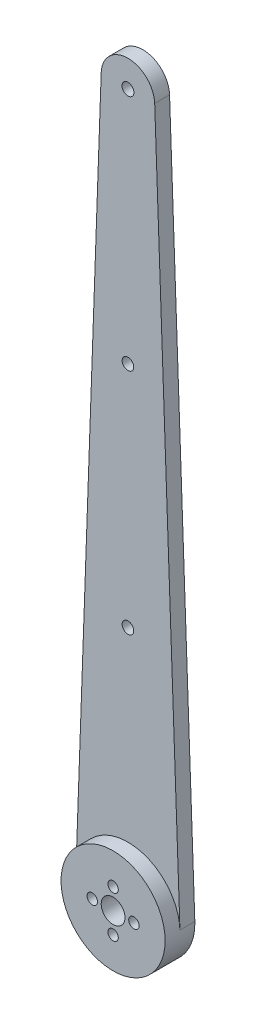
ISO-10303-21;
HEADER;
FILE_DESCRIPTION(('STEP AP214'),'2;1');
FILE_NAME('part.step','',(''),(''),'','','');
FILE_SCHEMA(('AUTOMOTIVE_DESIGN { 1 0 10303 214 1 1 1 1 }'));
ENDSEC;
DATA;
#1=APPLICATION_CONTEXT('core data for automotive mechanical design processes');
#2=APPLICATION_PROTOCOL_DEFINITION('international standard','automotive_design',2000,#1);
#3=PRODUCT_CONTEXT('',#1,'mechanical');
#4=PRODUCT('Part','Part','',(#3));
#5=PRODUCT_RELATED_PRODUCT_CATEGORY('part','',(#4));
#6=PRODUCT_DEFINITION_FORMATION('','',#4);
#7=PRODUCT_DEFINITION_CONTEXT('part definition',#1,'design');
#8=PRODUCT_DEFINITION('design','',#6,#7);
#9=PRODUCT_DEFINITION_SHAPE('','',#8);
#10=(LENGTH_UNIT() NAMED_UNIT(*) SI_UNIT(.MILLI.,.METRE.));
#11=(NAMED_UNIT(*) PLANE_ANGLE_UNIT() SI_UNIT($,.RADIAN.));
#12=(NAMED_UNIT(*) SI_UNIT($,.STERADIAN.) SOLID_ANGLE_UNIT());
#13=UNCERTAINTY_MEASURE_WITH_UNIT(LENGTH_MEASURE(1.E-05),#10,'distance_accuracy_value','');
#14=(GEOMETRIC_REPRESENTATION_CONTEXT(3) GLOBAL_UNCERTAINTY_ASSIGNED_CONTEXT((#13)) GLOBAL_UNIT_ASSIGNED_CONTEXT((#10,
#11,#12)) REPRESENTATION_CONTEXT('',''));
#15=CARTESIAN_POINT('',(0.,0.,0.));
#16=DIRECTION('',(0.,0.,1.));
#17=DIRECTION('',(1.,0.,0.));
#18=AXIS2_PLACEMENT_3D('',#15,#16,#17);
#19=CARTESIAN_POINT('',(0.,236.8,-5.));
#20=DIRECTION('',(0.,0.,1.));
#21=DIRECTION('',(1.,0.,0.));
#22=AXIS2_PLACEMENT_3D('',#19,#20,#21);
#23=CYLINDRICAL_SURFACE('',#22,9.00000000000001);
#24=CARTESIAN_POINT('',(0.,236.8,0.));
#25=DIRECTION('',(0.,0.,1.));
#26=DIRECTION('',(1.,0.,0.));
#27=AXIS2_PLACEMENT_3D('',#24,#25,#26);
#28=CIRCLE('',#27,9.00000000000001);
#29=CARTESIAN_POINT('',(8.99420001419527,237.123057432432,0.));
#30=VERTEX_POINT('',#29);
#31=CARTESIAN_POINT('',(-8.99420001419527,237.123057432432,0.));
#32=VERTEX_POINT('',#31);
#33=EDGE_CURVE('E139',#30,#32,#28,.T.);
#34=ORIENTED_EDGE('',*,*,#33,.F.);
#35=DIRECTION('',(0.,0.,1.));
#36=VECTOR('',#35,1.);
#37=CARTESIAN_POINT('',(8.99420001419527,237.123057432432,-5.));
#38=LINE('',#37,#36);
#39=CARTESIAN_POINT('',(8.99420001419527,237.123057432432,-5.));
#40=VERTEX_POINT('',#39);
#41=EDGE_CURVE('E11',#40,#30,#38,.T.);
#42=ORIENTED_EDGE('',*,*,#41,.F.);
#43=CARTESIAN_POINT('',(0.,236.8,-5.));
#44=DIRECTION('',(0.,0.,1.));
#45=DIRECTION('',(1.,0.,0.));
#46=AXIS2_PLACEMENT_3D('',#43,#44,#45);
#47=CIRCLE('',#46,9.00000000000001);
#48=CARTESIAN_POINT('',(-8.99420001419527,237.123057432432,-5.));
#49=VERTEX_POINT('',#48);
#50=EDGE_CURVE('E83',#40,#49,#47,.T.);
#51=ORIENTED_EDGE('',*,*,#50,.T.);
#52=DIRECTION('',(0.,0.,1.));
#53=VECTOR('',#52,1.);
#54=CARTESIAN_POINT('',(-8.99420001419527,237.123057432432,-5.));
#55=LINE('',#54,#53);
#56=EDGE_CURVE('E36',#49,#32,#55,.T.);
#57=ORIENTED_EDGE('',*,*,#56,.T.);
#58=EDGE_LOOP('',(#34,#42,#51,#57));
#59=FACE_BOUND('',#58,.T.);
#60=ADVANCED_FACE('F33',(#59),#23,.T.);
#61=CARTESIAN_POINT('',(8.99420001419527,237.123057432432,-5.));
#62=DIRECTION('',(0.999355557132808,0.0358952702702703,0.));
#63=DIRECTION('',(-0.0358952702702703,0.999355557132808,0.));
#64=AXIS2_PLACEMENT_3D('',#61,#62,#63);
#65=PLANE('',#64);
#66=DIRECTION('',(-0.0358952702702703,0.999355557132807,0.));
#67=VECTOR('',#66,1.);
#68=CARTESIAN_POINT('',(8.99420001419527,237.123057432432,0.));
#69=LINE('',#68,#67);
#70=CARTESIAN_POINT('',(17.4887222498241,0.62816722972973,0.));
#71=VERTEX_POINT('',#70);
#72=EDGE_CURVE('E76',#71,#30,#69,.T.);
#73=ORIENTED_EDGE('',*,*,#72,.F.);
#74=DIRECTION('',(0.,0.,1.));
#75=VECTOR('',#74,1.);
#76=CARTESIAN_POINT('',(17.4887222498241,0.62816722972973,-5.));
#77=LINE('',#76,#75);
#78=CARTESIAN_POINT('',(17.4887222498241,0.62816722972973,-5.));
#79=VERTEX_POINT('',#78);
#80=EDGE_CURVE('E42',#79,#71,#77,.T.);
#81=ORIENTED_EDGE('',*,*,#80,.F.);
#82=DIRECTION('',(-0.0358952702702703,0.999355557132807,0.));
#83=VECTOR('',#82,1.);
#84=CARTESIAN_POINT('',(8.99420001419527,237.123057432432,-5.));
#85=LINE('',#84,#83);
#86=EDGE_CURVE('E144',#79,#40,#85,.T.);
#87=ORIENTED_EDGE('',*,*,#86,.T.);
#88=ORIENTED_EDGE('',*,*,#41,.T.);
#89=EDGE_LOOP('',(#73,#81,#87,#88));
#90=FACE_BOUND('',#89,.T.);
#91=ADVANCED_FACE('F78',(#90),#65,.T.);
#92=CARTESIAN_POINT('',(0.,0.,-5.));
#93=DIRECTION('',(0.,0.,1.));
#94=DIRECTION('',(1.,0.,0.));
#95=AXIS2_PLACEMENT_3D('',#92,#93,#94);
#96=CYLINDRICAL_SURFACE('',#95,17.5);
#97=ORIENTED_EDGE('',*,*,#80,.T.);
#98=CARTESIAN_POINT('',(0.,0.,0.));
#99=DIRECTION('',(0.,0.,1.));
#100=DIRECTION('',(1.,0.,0.));
#101=AXIS2_PLACEMENT_3D('',#98,#99,#100);
#102=CIRCLE('',#101,17.5);
#103=CARTESIAN_POINT('',(-17.4887222498241,0.628167229729727,0.));
#104=VERTEX_POINT('',#103);
#105=EDGE_CURVE('E90',#71,#104,#102,.T.);
#106=ORIENTED_EDGE('',*,*,#105,.T.);
#107=DIRECTION('',(0.,0.,1.));
#108=VECTOR('',#107,1.);
#109=CARTESIAN_POINT('',(-17.4887222498241,0.628167229729727,-5.));
#110=LINE('',#109,#108);
#111=CARTESIAN_POINT('',(-17.4887222498241,0.628167229729727,-5.));
#112=VERTEX_POINT('',#111);
#113=EDGE_CURVE('E65',#112,#104,#110,.T.);
#114=ORIENTED_EDGE('',*,*,#113,.F.);
#115=CARTESIAN_POINT('',(0.,0.,-5.));
#116=DIRECTION('',(0.,0.,1.));
#117=DIRECTION('',(1.,0.,0.));
#118=AXIS2_PLACEMENT_3D('',#115,#116,#117);
#119=CIRCLE('',#118,17.5);
#120=EDGE_CURVE('E92',#112,#79,#119,.T.);
#121=ORIENTED_EDGE('',*,*,#120,.T.);
#122=EDGE_LOOP('',(#97,#106,#114,#121));
#123=FACE_BOUND('',#122,.T.);
#124=CARTESIAN_POINT('',(0.,0.,5.));
#125=DIRECTION('',(0.,0.,1.));
#126=DIRECTION('',(1.,0.,0.));
#127=AXIS2_PLACEMENT_3D('',#124,#125,#126);
#128=CIRCLE('',#127,17.5);
#129=CARTESIAN_POINT('',(17.5,0.,5.));
#130=VERTEX_POINT('',#129);
#131=EDGE_CURVE('E97',#130,#130,#128,.T.);
#132=ORIENTED_EDGE('',*,*,#131,.F.);
#133=EDGE_LOOP('',(#132));
#134=FACE_BOUND('',#133,.T.);
#135=ADVANCED_FACE('F88',(#123,#134),#96,.T.);
#136=CARTESIAN_POINT('',(-8.99420001419527,237.123057432432,-5.));
#137=DIRECTION('',(-0.999355557132808,0.0358952702702703,0.));
#138=DIRECTION('',(-0.0358952702702703,-0.999355557132808,0.));
#139=AXIS2_PLACEMENT_3D('',#136,#137,#138);
#140=PLANE('',#139);
#141=DIRECTION('',(-0.0358952702702703,-0.999355557132807,0.));
#142=VECTOR('',#141,1.);
#143=CARTESIAN_POINT('',(-8.99420001419527,237.123057432432,0.));
#144=LINE('',#143,#142);
#145=EDGE_CURVE('E84',#32,#104,#144,.T.);
#146=ORIENTED_EDGE('',*,*,#145,.F.);
#147=ORIENTED_EDGE('',*,*,#56,.F.);
#148=DIRECTION('',(-0.0358952702702703,-0.999355557132807,0.));
#149=VECTOR('',#148,1.);
#150=CARTESIAN_POINT('',(-8.99420001419527,237.123057432432,-5.));
#151=LINE('',#150,#149);
#152=EDGE_CURVE('E141',#49,#112,#151,.T.);
#153=ORIENTED_EDGE('',*,*,#152,.T.);
#154=ORIENTED_EDGE('',*,*,#113,.T.);
#155=EDGE_LOOP('',(#146,#147,#153,#154));
#156=FACE_BOUND('',#155,.T.);
#157=ADVANCED_FACE('F147',(#156),#140,.T.);
#158=CARTESIAN_POINT('',(0.,236.8,-5.));
#159=DIRECTION('',(0.,0.,1.));
#160=DIRECTION('',(1.,0.,0.));
#161=AXIS2_PLACEMENT_3D('',#158,#159,#160);
#162=PLANE('',#161);
#163=CARTESIAN_POINT('',(7.,0.,-5.));
#164=DIRECTION('',(0.,0.,1.));
#165=DIRECTION('',(1.,0.,0.));
#166=AXIS2_PLACEMENT_3D('',#163,#164,#165);
#167=CIRCLE('',#166,1.75);
#168=CARTESIAN_POINT('',(8.75,0.,-5.));
#169=VERTEX_POINT('',#168);
#170=EDGE_CURVE('E115',#169,#169,#167,.T.);
#171=ORIENTED_EDGE('',*,*,#170,.T.);
#172=EDGE_LOOP('',(#171));
#173=FACE_BOUND('',#172,.T.);
#174=CARTESIAN_POINT('',(0.,7.,-5.));
#175=DIRECTION('',(0.,0.,1.));
#176=DIRECTION('',(1.,0.,0.));
#177=AXIS2_PLACEMENT_3D('',#174,#175,#176);
#178=CIRCLE('',#177,1.75);
#179=CARTESIAN_POINT('',(1.75,7.,-5.));
#180=VERTEX_POINT('',#179);
#181=EDGE_CURVE('E112',#180,#180,#178,.T.);
#182=ORIENTED_EDGE('',*,*,#181,.T.);
#183=EDGE_LOOP('',(#182));
#184=FACE_BOUND('',#183,.T.);
#185=CARTESIAN_POINT('',(0.,-7.,-5.));
#186=DIRECTION('',(0.,0.,1.));
#187=DIRECTION('',(1.,0.,0.));
#188=AXIS2_PLACEMENT_3D('',#185,#186,#187);
#189=CIRCLE('',#188,1.75);
#190=CARTESIAN_POINT('',(1.75,-7.,-5.));
#191=VERTEX_POINT('',#190);
#192=EDGE_CURVE('E109',#191,#191,#189,.T.);
#193=ORIENTED_EDGE('',*,*,#192,.T.);
#194=EDGE_LOOP('',(#193));
#195=FACE_BOUND('',#194,.T.);
#196=CARTESIAN_POINT('',(-7.,0.,-5.));
#197=DIRECTION('',(0.,0.,1.));
#198=DIRECTION('',(1.,0.,0.));
#199=AXIS2_PLACEMENT_3D('',#196,#197,#198);
#200=CIRCLE('',#199,1.75);
#201=CARTESIAN_POINT('',(-5.25,0.,-5.));
#202=VERTEX_POINT('',#201);
#203=EDGE_CURVE('E101',#202,#202,#200,.T.);
#204=ORIENTED_EDGE('',*,*,#203,.T.);
#205=EDGE_LOOP('',(#204));
#206=FACE_BOUND('',#205,.T.);
#207=CARTESIAN_POINT('',(0.,156.8,-5.));
#208=DIRECTION('',(0.,0.,1.));
#209=DIRECTION('',(1.,0.,0.));
#210=AXIS2_PLACEMENT_3D('',#207,#208,#209);
#211=CIRCLE('',#210,1.94999999999999);
#212=CARTESIAN_POINT('',(1.95,156.8,-5.));
#213=VERTEX_POINT('',#212);
#214=EDGE_CURVE('E121',#213,#213,#211,.T.);
#215=ORIENTED_EDGE('',*,*,#214,.T.);
#216=EDGE_LOOP('',(#215));
#217=FACE_BOUND('',#216,.T.);
#218=CARTESIAN_POINT('',(0.,80.,-5.));
#219=DIRECTION('',(0.,0.,1.));
#220=DIRECTION('',(1.,0.,0.));
#221=AXIS2_PLACEMENT_3D('',#218,#219,#220);
#222=CIRCLE('',#221,1.94999999999999);
#223=CARTESIAN_POINT('',(1.95000000000001,80.,-5.));
#224=VERTEX_POINT('',#223);
#225=EDGE_CURVE('E127',#224,#224,#222,.T.);
#226=ORIENTED_EDGE('',*,*,#225,.T.);
#227=EDGE_LOOP('',(#226));
#228=FACE_BOUND('',#227,.T.);
#229=CARTESIAN_POINT('',(0.,236.8,-5.));
#230=DIRECTION('',(0.,0.,1.));
#231=DIRECTION('',(1.,0.,0.));
#232=AXIS2_PLACEMENT_3D('',#229,#230,#231);
#233=CIRCLE('',#232,2.);
#234=CARTESIAN_POINT('',(2.,236.8,-5.));
#235=VERTEX_POINT('',#234);
#236=EDGE_CURVE('E131',#235,#235,#233,.T.);
#237=ORIENTED_EDGE('',*,*,#236,.T.);
#238=EDGE_LOOP('',(#237));
#239=FACE_BOUND('',#238,.T.);
#240=CARTESIAN_POINT('',(0.,0.,-5.));
#241=DIRECTION('',(0.,0.,1.));
#242=DIRECTION('',(1.,0.,0.));
#243=AXIS2_PLACEMENT_3D('',#240,#241,#242);
#244=CIRCLE('',#243,4.);
#245=CARTESIAN_POINT('',(4.,0.,-5.));
#246=VERTEX_POINT('',#245);
#247=EDGE_CURVE('E134',#246,#246,#244,.T.);
#248=ORIENTED_EDGE('',*,*,#247,.T.);
#249=EDGE_LOOP('',(#248));
#250=FACE_BOUND('',#249,.T.);
#251=ORIENTED_EDGE('',*,*,#50,.F.);
#252=ORIENTED_EDGE('',*,*,#86,.F.);
#253=ORIENTED_EDGE('',*,*,#120,.F.);
#254=ORIENTED_EDGE('',*,*,#152,.F.);
#255=EDGE_LOOP('',(#251,#252,#253,#254));
#256=FACE_BOUND('',#255,.T.);
#257=ADVANCED_FACE('F149',(#173,#184,#195,#206,#217,#228,#239,#250,#256),#162,.F.);
#258=CARTESIAN_POINT('',(0.,236.8,0.));
#259=DIRECTION('',(0.,0.,1.));
#260=DIRECTION('',(1.,0.,0.));
#261=AXIS2_PLACEMENT_3D('',#258,#259,#260);
#262=PLANE('',#261);
#263=ORIENTED_EDGE('',*,*,#105,.F.);
#264=ORIENTED_EDGE('',*,*,#72,.T.);
#265=ORIENTED_EDGE('',*,*,#33,.T.);
#266=ORIENTED_EDGE('',*,*,#145,.T.);
#267=EDGE_LOOP('',(#263,#264,#265,#266));
#268=FACE_BOUND('',#267,.T.);
#269=CARTESIAN_POINT('',(0.,156.8,0.));
#270=DIRECTION('',(0.,0.,1.));
#271=DIRECTION('',(1.,0.,0.));
#272=AXIS2_PLACEMENT_3D('',#269,#270,#271);
#273=CIRCLE('',#272,1.94999999999999);
#274=CARTESIAN_POINT('',(1.95,156.8,0.));
#275=VERTEX_POINT('',#274);
#276=EDGE_CURVE('E118',#275,#275,#273,.T.);
#277=ORIENTED_EDGE('',*,*,#276,.F.);
#278=EDGE_LOOP('',(#277));
#279=FACE_BOUND('',#278,.T.);
#280=CARTESIAN_POINT('',(0.,80.,0.));
#281=DIRECTION('',(0.,0.,1.));
#282=DIRECTION('',(1.,0.,0.));
#283=AXIS2_PLACEMENT_3D('',#280,#281,#282);
#284=CIRCLE('',#283,1.94999999999999);
#285=CARTESIAN_POINT('',(1.95000000000001,80.,0.));
#286=VERTEX_POINT('',#285);
#287=EDGE_CURVE('E124',#286,#286,#284,.T.);
#288=ORIENTED_EDGE('',*,*,#287,.F.);
#289=EDGE_LOOP('',(#288));
#290=FACE_BOUND('',#289,.T.);
#291=CARTESIAN_POINT('',(0.,236.8,0.));
#292=DIRECTION('',(0.,0.,1.));
#293=DIRECTION('',(1.,0.,0.));
#294=AXIS2_PLACEMENT_3D('',#291,#292,#293);
#295=CIRCLE('',#294,2.);
#296=CARTESIAN_POINT('',(2.,236.8,0.));
#297=VERTEX_POINT('',#296);
#298=EDGE_CURVE('E130',#297,#297,#295,.T.);
#299=ORIENTED_EDGE('',*,*,#298,.F.);
#300=EDGE_LOOP('',(#299));
#301=FACE_BOUND('',#300,.T.);
#302=ADVANCED_FACE('F95',(#268,#279,#290,#301),#262,.T.);
#303=CARTESIAN_POINT('',(0.,0.,-5.));
#304=DIRECTION('',(0.,0.,1.));
#305=DIRECTION('',(1.,0.,0.));
#306=AXIS2_PLACEMENT_3D('',#303,#304,#305);
#307=CYLINDRICAL_SURFACE('',#306,4.);
#308=ORIENTED_EDGE('',*,*,#247,.F.);
#309=EDGE_LOOP('',(#308));
#310=FACE_BOUND('',#309,.T.);
#311=CARTESIAN_POINT('',(0.,0.,5.));
#312=DIRECTION('',(0.,0.,1.));
#313=DIRECTION('',(1.,0.,0.));
#314=AXIS2_PLACEMENT_3D('',#311,#312,#313);
#315=CIRCLE('',#314,4.);
#316=CARTESIAN_POINT('',(4.,0.,5.));
#317=VERTEX_POINT('',#316);
#318=EDGE_CURVE('E218',#317,#317,#315,.T.);
#319=ORIENTED_EDGE('',*,*,#318,.T.);
#320=EDGE_LOOP('',(#319));
#321=FACE_BOUND('',#320,.T.);
#322=ADVANCED_FACE('F166',(#310,#321),#307,.F.);
#323=CARTESIAN_POINT('',(0.,236.8,-5.));
#324=DIRECTION('',(0.,0.,1.));
#325=DIRECTION('',(1.,0.,0.));
#326=AXIS2_PLACEMENT_3D('',#323,#324,#325);
#327=CYLINDRICAL_SURFACE('',#326,2.);
#328=ORIENTED_EDGE('',*,*,#236,.F.);
#329=EDGE_LOOP('',(#328));
#330=FACE_BOUND('',#329,.T.);
#331=ORIENTED_EDGE('',*,*,#298,.T.);
#332=EDGE_LOOP('',(#331));
#333=FACE_BOUND('',#332,.T.);
#334=ADVANCED_FACE('F170',(#330,#333),#327,.F.);
#335=CARTESIAN_POINT('',(0.,80.,0.));
#336=DIRECTION('',(0.,0.,1.));
#337=DIRECTION('',(1.,0.,0.));
#338=AXIS2_PLACEMENT_3D('',#335,#336,#337);
#339=CYLINDRICAL_SURFACE('',#338,1.94999999999999);
#340=ORIENTED_EDGE('',*,*,#287,.T.);
#341=EDGE_LOOP('',(#340));
#342=FACE_BOUND('',#341,.T.);
#343=ORIENTED_EDGE('',*,*,#225,.F.);
#344=EDGE_LOOP('',(#343));
#345=FACE_BOUND('',#344,.T.);
#346=ADVANCED_FACE('F174',(#342,#345),#339,.F.);
#347=CARTESIAN_POINT('',(0.,156.8,0.));
#348=DIRECTION('',(0.,0.,1.));
#349=DIRECTION('',(1.,0.,0.));
#350=AXIS2_PLACEMENT_3D('',#347,#348,#349);
#351=CYLINDRICAL_SURFACE('',#350,1.94999999999999);
#352=ORIENTED_EDGE('',*,*,#276,.T.);
#353=EDGE_LOOP('',(#352));
#354=FACE_BOUND('',#353,.T.);
#355=ORIENTED_EDGE('',*,*,#214,.F.);
#356=EDGE_LOOP('',(#355));
#357=FACE_BOUND('',#356,.T.);
#358=ADVANCED_FACE('F178',(#354,#357),#351,.F.);
#359=CARTESIAN_POINT('',(-7.,0.,-10.));
#360=DIRECTION('',(0.,0.,1.));
#361=DIRECTION('',(1.,0.,0.));
#362=AXIS2_PLACEMENT_3D('',#359,#360,#361);
#363=CYLINDRICAL_SURFACE('',#362,1.75);
#364=ORIENTED_EDGE('',*,*,#203,.F.);
#365=EDGE_LOOP('',(#364));
#366=FACE_BOUND('',#365,.T.);
#367=CARTESIAN_POINT('',(-7.,0.,5.));
#368=DIRECTION('',(0.,0.,1.));
#369=DIRECTION('',(1.,0.,0.));
#370=AXIS2_PLACEMENT_3D('',#367,#368,#369);
#371=CIRCLE('',#370,1.75);
#372=CARTESIAN_POINT('',(-5.25,0.,5.));
#373=VERTEX_POINT('',#372);
#374=EDGE_CURVE('E207',#373,#373,#371,.T.);
#375=ORIENTED_EDGE('',*,*,#374,.T.);
#376=EDGE_LOOP('',(#375));
#377=FACE_BOUND('',#376,.T.);
#378=ADVANCED_FACE('F182',(#366,#377),#363,.F.);
#379=CARTESIAN_POINT('',(0.,-7.,-10.));
#380=DIRECTION('',(0.,0.,1.));
#381=DIRECTION('',(1.,0.,0.));
#382=AXIS2_PLACEMENT_3D('',#379,#380,#381);
#383=CYLINDRICAL_SURFACE('',#382,1.75);
#384=ORIENTED_EDGE('',*,*,#192,.F.);
#385=EDGE_LOOP('',(#384));
#386=FACE_BOUND('',#385,.T.);
#387=CARTESIAN_POINT('',(0.,-7.,5.));
#388=DIRECTION('',(0.,0.,1.));
#389=DIRECTION('',(1.,0.,0.));
#390=AXIS2_PLACEMENT_3D('',#387,#388,#389);
#391=CIRCLE('',#390,1.75);
#392=CARTESIAN_POINT('',(1.75,-7.,5.));
#393=VERTEX_POINT('',#392);
#394=EDGE_CURVE('E104',#393,#393,#391,.T.);
#395=ORIENTED_EDGE('',*,*,#394,.T.);
#396=EDGE_LOOP('',(#395));
#397=FACE_BOUND('',#396,.T.);
#398=ADVANCED_FACE('F186',(#386,#397),#383,.F.);
#399=CARTESIAN_POINT('',(0.,7.,-10.));
#400=DIRECTION('',(0.,0.,1.));
#401=DIRECTION('',(1.,0.,0.));
#402=AXIS2_PLACEMENT_3D('',#399,#400,#401);
#403=CYLINDRICAL_SURFACE('',#402,1.75);
#404=ORIENTED_EDGE('',*,*,#181,.F.);
#405=EDGE_LOOP('',(#404));
#406=FACE_BOUND('',#405,.T.);
#407=CARTESIAN_POINT('',(0.,7.,5.));
#408=DIRECTION('',(0.,0.,1.));
#409=DIRECTION('',(1.,0.,0.));
#410=AXIS2_PLACEMENT_3D('',#407,#408,#409);
#411=CIRCLE('',#410,1.75);
#412=CARTESIAN_POINT('',(1.75,7.,5.));
#413=VERTEX_POINT('',#412);
#414=EDGE_CURVE('E221',#413,#413,#411,.T.);
#415=ORIENTED_EDGE('',*,*,#414,.T.);
#416=EDGE_LOOP('',(#415));
#417=FACE_BOUND('',#416,.T.);
#418=ADVANCED_FACE('F190',(#406,#417),#403,.F.);
#419=CARTESIAN_POINT('',(7.,0.,-10.));
#420=DIRECTION('',(0.,0.,1.));
#421=DIRECTION('',(1.,0.,0.));
#422=AXIS2_PLACEMENT_3D('',#419,#420,#421);
#423=CYLINDRICAL_SURFACE('',#422,1.75);
#424=ORIENTED_EDGE('',*,*,#170,.F.);
#425=EDGE_LOOP('',(#424));
#426=FACE_BOUND('',#425,.T.);
#427=CARTESIAN_POINT('',(7.,0.,5.));
#428=DIRECTION('',(0.,0.,1.));
#429=DIRECTION('',(1.,0.,0.));
#430=AXIS2_PLACEMENT_3D('',#427,#428,#429);
#431=CIRCLE('',#430,1.75);
#432=CARTESIAN_POINT('',(8.75,0.,5.));
#433=VERTEX_POINT('',#432);
#434=EDGE_CURVE('E98',#433,#433,#431,.T.);
#435=ORIENTED_EDGE('',*,*,#434,.T.);
#436=EDGE_LOOP('',(#435));
#437=FACE_BOUND('',#436,.T.);
#438=ADVANCED_FACE('F194',(#426,#437),#423,.F.);
#439=CARTESIAN_POINT('',(0.,0.,5.));
#440=DIRECTION('',(0.,0.,1.));
#441=DIRECTION('',(1.,0.,0.));
#442=AXIS2_PLACEMENT_3D('',#439,#440,#441);
#443=PLANE('',#442);
#444=ORIENTED_EDGE('',*,*,#374,.F.);
#445=EDGE_LOOP('',(#444));
#446=FACE_BOUND('',#445,.T.);
#447=ORIENTED_EDGE('',*,*,#394,.F.);
#448=EDGE_LOOP('',(#447));
#449=FACE_BOUND('',#448,.T.);
#450=ORIENTED_EDGE('',*,*,#131,.T.);
#451=EDGE_LOOP('',(#450));
#452=FACE_BOUND('',#451,.T.);
#453=ORIENTED_EDGE('',*,*,#434,.F.);
#454=EDGE_LOOP('',(#453));
#455=FACE_BOUND('',#454,.T.);
#456=ORIENTED_EDGE('',*,*,#318,.F.);
#457=EDGE_LOOP('',(#456));
#458=FACE_BOUND('',#457,.T.);
#459=ORIENTED_EDGE('',*,*,#414,.F.);
#460=EDGE_LOOP('',(#459));
#461=FACE_BOUND('',#460,.T.);
#462=ADVANCED_FACE('F198',(#446,#449,#452,#455,#458,#461),#443,.T.);
#463=CLOSED_SHELL('',(#60,#91,#135,#157,#257,#302,#322,#334,#346,#358,#378,#398,#418,#438,#462));
#464=MANIFOLD_SOLID_BREP('B2',#463);
#465=ADVANCED_BREP_SHAPE_REPRESENTATION('',(#18,#464),#14);
#466=SHAPE_DEFINITION_REPRESENTATION(#9,#465);
ENDSEC;
END-ISO-10303-21;
